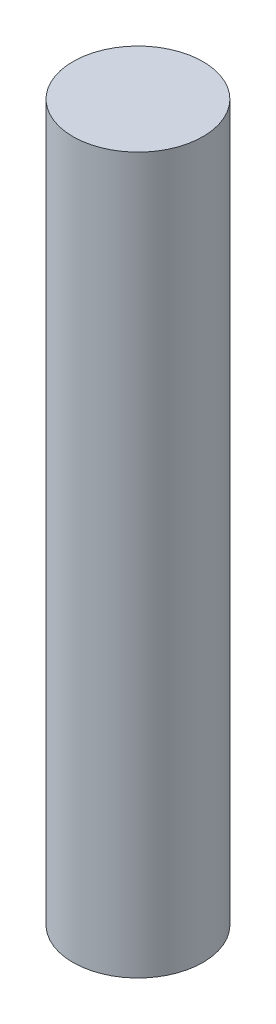
ISO-10303-21;
HEADER;
FILE_DESCRIPTION(('STEP AP214'),'2;1');
FILE_NAME('part.step','',(''),(''),'','','');
FILE_SCHEMA(('AUTOMOTIVE_DESIGN { 1 0 10303 214 1 1 1 1 }'));
ENDSEC;
DATA;
#1=APPLICATION_CONTEXT('core data for automotive mechanical design processes');
#2=APPLICATION_PROTOCOL_DEFINITION('international standard','automotive_design',2000,#1);
#3=PRODUCT_CONTEXT('',#1,'mechanical');
#4=PRODUCT('Part','Part','',(#3));
#5=PRODUCT_RELATED_PRODUCT_CATEGORY('part','',(#4));
#6=PRODUCT_DEFINITION_FORMATION('','',#4);
#7=PRODUCT_DEFINITION_CONTEXT('part definition',#1,'design');
#8=PRODUCT_DEFINITION('design','',#6,#7);
#9=PRODUCT_DEFINITION_SHAPE('','',#8);
#10=(LENGTH_UNIT() NAMED_UNIT(*) SI_UNIT(.MILLI.,.METRE.));
#11=(NAMED_UNIT(*) PLANE_ANGLE_UNIT() SI_UNIT($,.RADIAN.));
#12=(NAMED_UNIT(*) SI_UNIT($,.STERADIAN.) SOLID_ANGLE_UNIT());
#13=UNCERTAINTY_MEASURE_WITH_UNIT(LENGTH_MEASURE(1.E-05),#10,'distance_accuracy_value','');
#14=(GEOMETRIC_REPRESENTATION_CONTEXT(3) GLOBAL_UNCERTAINTY_ASSIGNED_CONTEXT((#13)) GLOBAL_UNIT_ASSIGNED_CONTEXT((#10,
#11,#12)) REPRESENTATION_CONTEXT('',''));
#15=CARTESIAN_POINT('',(0.,0.,0.));
#16=DIRECTION('',(0.,0.,1.));
#17=DIRECTION('',(1.,0.,0.));
#18=AXIS2_PLACEMENT_3D('',#15,#16,#17);
#19=CARTESIAN_POINT('',(0.,22.,0.));
#20=DIRECTION('',(0.,-1.,0.));
#21=DIRECTION('',(0.,0.,-1.));
#22=AXIS2_PLACEMENT_3D('',#19,#20,#21);
#23=CYLINDRICAL_SURFACE('',#22,2.);
#24=CARTESIAN_POINT('',(0.,22.,0.));
#25=DIRECTION('',(0.,1.,0.));
#26=DIRECTION('',(0.,0.,1.));
#27=AXIS2_PLACEMENT_3D('',#24,#25,#26);
#28=CIRCLE('',#27,2.);
#29=CARTESIAN_POINT('',(0.,22.,2.));
#30=VERTEX_POINT('',#29);
#31=EDGE_CURVE('E10',#30,#30,#28,.T.);
#32=ORIENTED_EDGE('',*,*,#31,.F.);
#33=EDGE_LOOP('',(#32));
#34=FACE_BOUND('',#33,.T.);
#35=CARTESIAN_POINT('',(0.,0.,0.));
#36=DIRECTION('',(0.,1.,0.));
#37=DIRECTION('',(0.,0.,1.));
#38=AXIS2_PLACEMENT_3D('',#35,#36,#37);
#39=CIRCLE('',#38,2.);
#40=CARTESIAN_POINT('',(0.,0.,2.));
#41=VERTEX_POINT('',#40);
#42=EDGE_CURVE('E34',#41,#41,#39,.T.);
#43=ORIENTED_EDGE('',*,*,#42,.T.);
#44=EDGE_LOOP('',(#43));
#45=FACE_BOUND('',#44,.T.);
#46=ADVANCED_FACE('F31',(#34,#45),#23,.T.);
#47=CARTESIAN_POINT('',(0.,22.,0.));
#48=DIRECTION('',(0.,1.,0.));
#49=DIRECTION('',(0.,0.,1.));
#50=AXIS2_PLACEMENT_3D('',#47,#48,#49);
#51=PLANE('',#50);
#52=ORIENTED_EDGE('',*,*,#31,.T.);
#53=EDGE_LOOP('',(#52));
#54=FACE_BOUND('',#53,.T.);
#55=ADVANCED_FACE('F46',(#54),#51,.T.);
#56=CARTESIAN_POINT('',(0.,0.,0.));
#57=DIRECTION('',(0.,1.,0.));
#58=DIRECTION('',(0.,0.,1.));
#59=AXIS2_PLACEMENT_3D('',#56,#57,#58);
#60=PLANE('',#59);
#61=ORIENTED_EDGE('',*,*,#42,.F.);
#62=EDGE_LOOP('',(#61));
#63=FACE_BOUND('',#62,.T.);
#64=ADVANCED_FACE('F44',(#63),#60,.F.);
#65=CLOSED_SHELL('',(#46,#55,#64));
#66=MANIFOLD_SOLID_BREP('B2',#65);
#67=ADVANCED_BREP_SHAPE_REPRESENTATION('',(#18,#66),#14);
#68=SHAPE_DEFINITION_REPRESENTATION(#9,#67);
ENDSEC;
END-ISO-10303-21;
